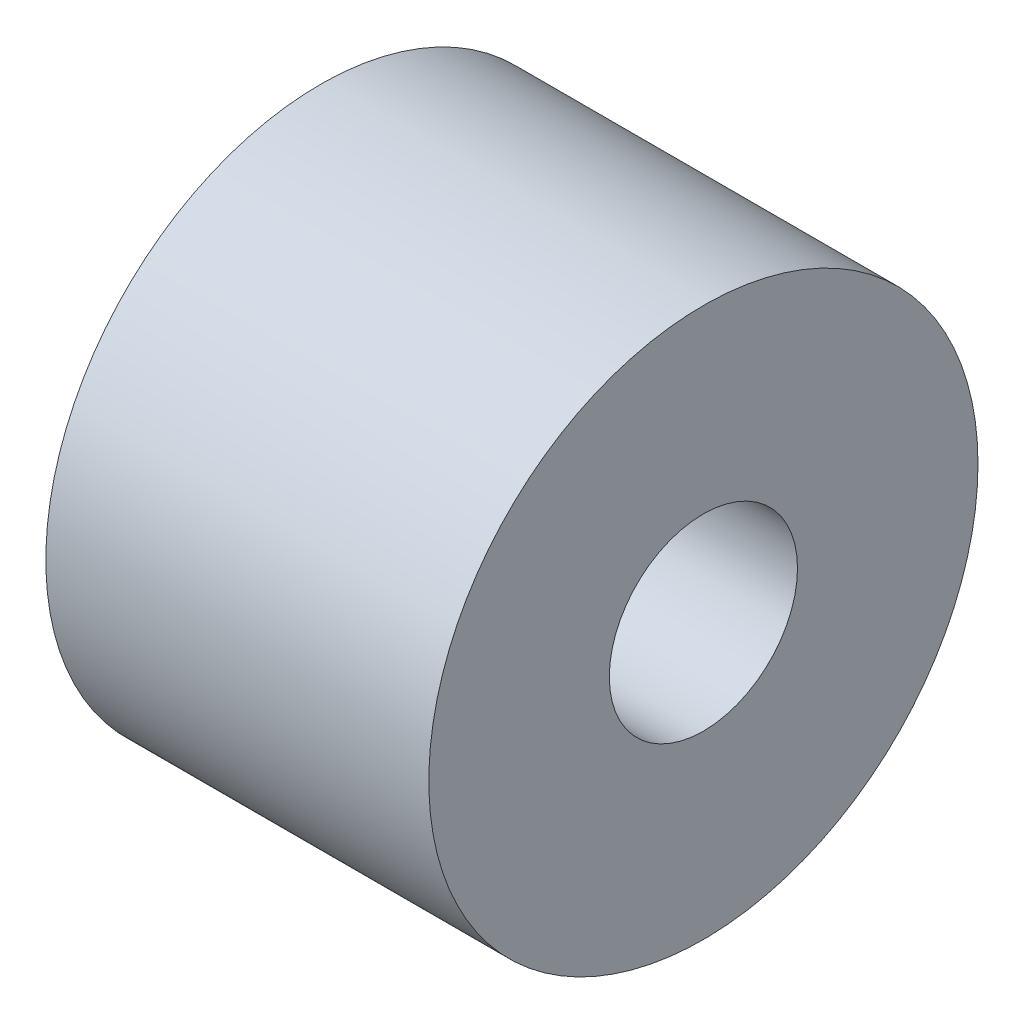
ISO-10303-21;
HEADER;
FILE_DESCRIPTION(('STEP AP214'),'2;1');
FILE_NAME('part.step','',(''),(''),'','','');
FILE_SCHEMA(('AUTOMOTIVE_DESIGN { 1 0 10303 214 1 1 1 1 }'));
ENDSEC;
DATA;
#1=APPLICATION_CONTEXT('core data for automotive mechanical design processes');
#2=APPLICATION_PROTOCOL_DEFINITION('international standard','automotive_design',2000,#1);
#3=PRODUCT_CONTEXT('',#1,'mechanical');
#4=PRODUCT('Part','Part','',(#3));
#5=PRODUCT_RELATED_PRODUCT_CATEGORY('part','',(#4));
#6=PRODUCT_DEFINITION_FORMATION('','',#4);
#7=PRODUCT_DEFINITION_CONTEXT('part definition',#1,'design');
#8=PRODUCT_DEFINITION('design','',#6,#7);
#9=PRODUCT_DEFINITION_SHAPE('','',#8);
#10=(LENGTH_UNIT() NAMED_UNIT(*) SI_UNIT(.MILLI.,.METRE.));
#11=(NAMED_UNIT(*) PLANE_ANGLE_UNIT() SI_UNIT($,.RADIAN.));
#12=(NAMED_UNIT(*) SI_UNIT($,.STERADIAN.) SOLID_ANGLE_UNIT());
#13=UNCERTAINTY_MEASURE_WITH_UNIT(LENGTH_MEASURE(1.E-05),#10,'distance_accuracy_value','');
#14=(GEOMETRIC_REPRESENTATION_CONTEXT(3) GLOBAL_UNCERTAINTY_ASSIGNED_CONTEXT((#13)) GLOBAL_UNIT_ASSIGNED_CONTEXT((#10,
#11,#12)) REPRESENTATION_CONTEXT('',''));
#15=CARTESIAN_POINT('',(0.,0.,0.));
#16=DIRECTION('',(0.,0.,1.));
#17=DIRECTION('',(1.,0.,0.));
#18=AXIS2_PLACEMENT_3D('',#15,#16,#17);
#19=CARTESIAN_POINT('',(6.64209999999998,0.,0.));
#20=DIRECTION('',(-1.,0.,0.));
#21=DIRECTION('',(0.,0.,1.));
#22=AXIS2_PLACEMENT_3D('',#19,#20,#21);
#23=CYLINDRICAL_SURFACE('',#22,9.525);
#24=CARTESIAN_POINT('',(6.64209999999998,0.,0.));
#25=DIRECTION('',(1.,0.,0.));
#26=DIRECTION('',(0.,0.,-1.));
#27=AXIS2_PLACEMENT_3D('',#24,#25,#26);
#28=CIRCLE('',#27,9.525);
#29=CARTESIAN_POINT('',(6.64209999999998,0.,-9.525));
#30=VERTEX_POINT('',#29);
#31=EDGE_CURVE('E10',#30,#30,#28,.T.);
#32=ORIENTED_EDGE('',*,*,#31,.F.);
#33=EDGE_LOOP('',(#32));
#34=FACE_BOUND('',#33,.T.);
#35=CARTESIAN_POINT('',(-6.64209999999998,0.,0.));
#36=DIRECTION('',(1.,0.,0.));
#37=DIRECTION('',(0.,0.,-1.));
#38=AXIS2_PLACEMENT_3D('',#35,#36,#37);
#39=CIRCLE('',#38,9.525);
#40=CARTESIAN_POINT('',(-6.64209999999998,0.,-9.525));
#41=VERTEX_POINT('',#40);
#42=EDGE_CURVE('E33',#41,#41,#39,.T.);
#43=ORIENTED_EDGE('',*,*,#42,.T.);
#44=EDGE_LOOP('',(#43));
#45=FACE_BOUND('',#44,.T.);
#46=ADVANCED_FACE('F30',(#34,#45),#23,.T.);
#47=CARTESIAN_POINT('',(6.64209999999998,0.,0.));
#48=DIRECTION('',(1.,0.,0.));
#49=DIRECTION('',(0.,0.,-1.));
#50=AXIS2_PLACEMENT_3D('',#47,#48,#49);
#51=PLANE('',#50);
#52=CARTESIAN_POINT('',(6.64209999999998,0.,0.));
#53=DIRECTION('',(1.,0.,0.));
#54=DIRECTION('',(0.,0.,-1.));
#55=AXIS2_PLACEMENT_3D('',#52,#53,#54);
#56=CIRCLE('',#55,3.2639);
#57=CARTESIAN_POINT('',(6.64209999999998,0.,-3.2639));
#58=VERTEX_POINT('',#57);
#59=EDGE_CURVE('E42',#58,#58,#56,.T.);
#60=ORIENTED_EDGE('',*,*,#59,.F.);
#61=EDGE_LOOP('',(#60));
#62=FACE_BOUND('',#61,.T.);
#63=ORIENTED_EDGE('',*,*,#31,.T.);
#64=EDGE_LOOP('',(#63));
#65=FACE_BOUND('',#64,.T.);
#66=ADVANCED_FACE('F57',(#62,#65),#51,.T.);
#67=CARTESIAN_POINT('',(-6.64209999999998,0.,0.));
#68=DIRECTION('',(1.,0.,0.));
#69=DIRECTION('',(0.,0.,-1.));
#70=AXIS2_PLACEMENT_3D('',#67,#68,#69);
#71=PLANE('',#70);
#72=CARTESIAN_POINT('',(-6.64209999999998,0.,0.));
#73=DIRECTION('',(1.,0.,0.));
#74=DIRECTION('',(0.,0.,-1.));
#75=AXIS2_PLACEMENT_3D('',#72,#73,#74);
#76=CIRCLE('',#75,3.2639);
#77=CARTESIAN_POINT('',(-6.64209999999998,0.,-3.2639));
#78=VERTEX_POINT('',#77);
#79=EDGE_CURVE('E40',#78,#78,#76,.T.);
#80=ORIENTED_EDGE('',*,*,#79,.T.);
#81=EDGE_LOOP('',(#80));
#82=FACE_BOUND('',#81,.T.);
#83=ORIENTED_EDGE('',*,*,#42,.F.);
#84=EDGE_LOOP('',(#83));
#85=FACE_BOUND('',#84,.T.);
#86=ADVANCED_FACE('F48',(#82,#85),#71,.F.);
#87=CARTESIAN_POINT('',(-6.64209999999998,0.,0.));
#88=DIRECTION('',(1.,0.,0.));
#89=DIRECTION('',(0.,0.,-1.));
#90=AXIS2_PLACEMENT_3D('',#87,#88,#89);
#91=CYLINDRICAL_SURFACE('',#90,3.2639);
#92=ORIENTED_EDGE('',*,*,#79,.F.);
#93=EDGE_LOOP('',(#92));
#94=FACE_BOUND('',#93,.T.);
#95=ORIENTED_EDGE('',*,*,#59,.T.);
#96=EDGE_LOOP('',(#95));
#97=FACE_BOUND('',#96,.T.);
#98=ADVANCED_FACE('F51',(#94,#97),#91,.F.);
#99=CLOSED_SHELL('',(#46,#66,#86,#98));
#100=MANIFOLD_SOLID_BREP('B2',#99);
#101=ADVANCED_BREP_SHAPE_REPRESENTATION('',(#18,#100),#14);
#102=SHAPE_DEFINITION_REPRESENTATION(#9,#101);
ENDSEC;
END-ISO-10303-21;
